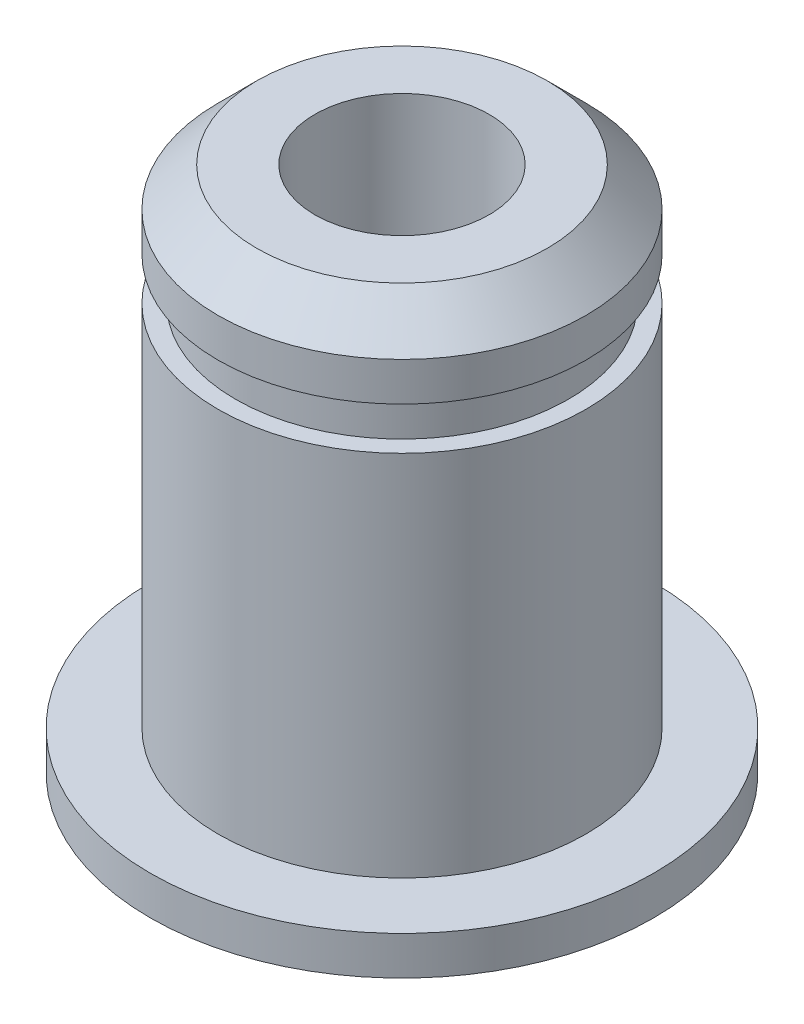
ISO-10303-21;
HEADER;
FILE_DESCRIPTION(('STEP AP214'),'2;1');
FILE_NAME('part.step','',(''),(''),'','','');
FILE_SCHEMA(('AUTOMOTIVE_DESIGN { 1 0 10303 214 1 1 1 1 }'));
ENDSEC;
DATA;
#1=APPLICATION_CONTEXT('core data for automotive mechanical design processes');
#2=APPLICATION_PROTOCOL_DEFINITION('international standard','automotive_design',2000,#1);
#3=PRODUCT_CONTEXT('',#1,'mechanical');
#4=PRODUCT('Part','Part','',(#3));
#5=PRODUCT_RELATED_PRODUCT_CATEGORY('part','',(#4));
#6=PRODUCT_DEFINITION_FORMATION('','',#4);
#7=PRODUCT_DEFINITION_CONTEXT('part definition',#1,'design');
#8=PRODUCT_DEFINITION('design','',#6,#7);
#9=PRODUCT_DEFINITION_SHAPE('','',#8);
#10=(LENGTH_UNIT() NAMED_UNIT(*) SI_UNIT(.MILLI.,.METRE.));
#11=(NAMED_UNIT(*) PLANE_ANGLE_UNIT() SI_UNIT($,.RADIAN.));
#12=(NAMED_UNIT(*) SI_UNIT($,.STERADIAN.) SOLID_ANGLE_UNIT());
#13=UNCERTAINTY_MEASURE_WITH_UNIT(LENGTH_MEASURE(1.E-05),#10,'distance_accuracy_value','');
#14=(GEOMETRIC_REPRESENTATION_CONTEXT(3) GLOBAL_UNCERTAINTY_ASSIGNED_CONTEXT((#13)) GLOBAL_UNIT_ASSIGNED_CONTEXT((#10,
#11,#12)) REPRESENTATION_CONTEXT('',''));
#15=CARTESIAN_POINT('',(0.,0.,0.));
#16=DIRECTION('',(0.,0.,1.));
#17=DIRECTION('',(1.,0.,0.));
#18=AXIS2_PLACEMENT_3D('',#15,#16,#17);
#19=CARTESIAN_POINT('',(0.,13.6,0.));
#20=DIRECTION('',(0.,1.,0.));
#21=DIRECTION('',(0.,0.,1.));
#22=AXIS2_PLACEMENT_3D('',#19,#20,#21);
#23=CYLINDRICAL_SURFACE('',#22,2.25);
#24=CARTESIAN_POINT('',(0.,13.6,0.));
#25=DIRECTION('',(0.,1.,0.));
#26=DIRECTION('',(0.,0.,1.));
#27=AXIS2_PLACEMENT_3D('',#24,#25,#26);
#28=CIRCLE('',#27,2.25);
#29=CARTESIAN_POINT('',(0.,13.6,2.25));
#30=VERTEX_POINT('',#29);
#31=EDGE_CURVE('E73',#30,#30,#28,.T.);
#32=ORIENTED_EDGE('',*,*,#31,.T.);
#33=EDGE_LOOP('',(#32));
#34=FACE_BOUND('',#33,.T.);
#35=CARTESIAN_POINT('',(0.,0.,0.));
#36=DIRECTION('',(0.,1.,0.));
#37=DIRECTION('',(0.,0.,1.));
#38=AXIS2_PLACEMENT_3D('',#35,#36,#37);
#39=CIRCLE('',#38,2.25);
#40=CARTESIAN_POINT('',(0.,0.,2.25));
#41=VERTEX_POINT('',#40);
#42=EDGE_CURVE('E46',#41,#41,#39,.T.);
#43=ORIENTED_EDGE('',*,*,#42,.F.);
#44=EDGE_LOOP('',(#43));
#45=FACE_BOUND('',#44,.T.);
#46=ADVANCED_FACE('F35',(#34,#45),#23,.F.);
#47=CARTESIAN_POINT('',(0.,0.,0.));
#48=DIRECTION('',(0.,1.,0.));
#49=DIRECTION('',(0.,0.,1.));
#50=AXIS2_PLACEMENT_3D('',#47,#48,#49);
#51=PLANE('',#50);
#52=CARTESIAN_POINT('',(0.,0.,0.));
#53=DIRECTION('',(0.,1.,0.));
#54=DIRECTION('',(0.,0.,1.));
#55=AXIS2_PLACEMENT_3D('',#52,#53,#54);
#56=CIRCLE('',#55,6.5);
#57=CARTESIAN_POINT('',(0.,0.,6.5));
#58=VERTEX_POINT('',#57);
#59=EDGE_CURVE('E50',#58,#58,#56,.T.);
#60=ORIENTED_EDGE('',*,*,#59,.F.);
#61=EDGE_LOOP('',(#60));
#62=FACE_BOUND('',#61,.T.);
#63=ORIENTED_EDGE('',*,*,#42,.T.);
#64=EDGE_LOOP('',(#63));
#65=FACE_BOUND('',#64,.T.);
#66=ADVANCED_FACE('F91',(#62,#65),#51,.F.);
#67=CARTESIAN_POINT('',(0.,13.6,0.));
#68=DIRECTION('',(0.,1.,0.));
#69=DIRECTION('',(0.,0.,1.));
#70=AXIS2_PLACEMENT_3D('',#67,#68,#69);
#71=CYLINDRICAL_SURFACE('',#70,6.5);
#72=CARTESIAN_POINT('',(0.,0.999999999999999,0.));
#73=DIRECTION('',(0.,1.,0.));
#74=DIRECTION('',(0.,0.,1.));
#75=AXIS2_PLACEMENT_3D('',#72,#73,#74);
#76=CIRCLE('',#75,6.5);
#77=CARTESIAN_POINT('',(0.,0.999999999999999,6.5));
#78=VERTEX_POINT('',#77);
#79=EDGE_CURVE('E55',#78,#78,#76,.T.);
#80=ORIENTED_EDGE('',*,*,#79,.F.);
#81=EDGE_LOOP('',(#80));
#82=FACE_BOUND('',#81,.T.);
#83=ORIENTED_EDGE('',*,*,#59,.T.);
#84=EDGE_LOOP('',(#83));
#85=FACE_BOUND('',#84,.T.);
#86=ADVANCED_FACE('F95',(#82,#85),#71,.T.);
#87=CARTESIAN_POINT('',(0.,1.,0.));
#88=DIRECTION('',(0.,-1.,0.));
#89=DIRECTION('',(0.,0.,-1.));
#90=AXIS2_PLACEMENT_3D('',#87,#88,#89);
#91=PLANE('',#90);
#92=CARTESIAN_POINT('',(0.,0.999999999999999,0.));
#93=DIRECTION('',(0.,1.,0.));
#94=DIRECTION('',(0.,0.,1.));
#95=AXIS2_PLACEMENT_3D('',#92,#93,#94);
#96=CIRCLE('',#95,4.75);
#97=CARTESIAN_POINT('',(0.,0.999999999999999,4.75));
#98=VERTEX_POINT('',#97);
#99=EDGE_CURVE('E58',#98,#98,#96,.T.);
#100=ORIENTED_EDGE('',*,*,#99,.F.);
#101=EDGE_LOOP('',(#100));
#102=FACE_BOUND('',#101,.T.);
#103=ORIENTED_EDGE('',*,*,#79,.T.);
#104=EDGE_LOOP('',(#103));
#105=FACE_BOUND('',#104,.T.);
#106=ADVANCED_FACE('F101',(#102,#105),#91,.F.);
#107=CARTESIAN_POINT('',(0.,13.6,0.));
#108=DIRECTION('',(0.,1.,0.));
#109=DIRECTION('',(0.,0.,1.));
#110=AXIS2_PLACEMENT_3D('',#107,#108,#109);
#111=CYLINDRICAL_SURFACE('',#110,4.75);
#112=CARTESIAN_POINT('',(0.,10.5,0.));
#113=DIRECTION('',(0.,1.,0.));
#114=DIRECTION('',(0.,0.,1.));
#115=AXIS2_PLACEMENT_3D('',#112,#113,#114);
#116=CIRCLE('',#115,4.75);
#117=CARTESIAN_POINT('',(0.,10.5,4.75));
#118=VERTEX_POINT('',#117);
#119=EDGE_CURVE('E61',#118,#118,#116,.T.);
#120=ORIENTED_EDGE('',*,*,#119,.F.);
#121=EDGE_LOOP('',(#120));
#122=FACE_BOUND('',#121,.T.);
#123=ORIENTED_EDGE('',*,*,#99,.T.);
#124=EDGE_LOOP('',(#123));
#125=FACE_BOUND('',#124,.T.);
#126=ADVANCED_FACE('F105',(#122,#125),#111,.T.);
#127=CARTESIAN_POINT('',(0.,10.5,0.));
#128=DIRECTION('',(0.,-1.,0.));
#129=DIRECTION('',(0.,0.,-1.));
#130=AXIS2_PLACEMENT_3D('',#127,#128,#129);
#131=PLANE('',#130);
#132=CARTESIAN_POINT('',(0.,10.5,0.));
#133=DIRECTION('',(0.,1.,0.));
#134=DIRECTION('',(0.,0.,1.));
#135=AXIS2_PLACEMENT_3D('',#132,#133,#134);
#136=CIRCLE('',#135,4.3);
#137=CARTESIAN_POINT('',(0.,10.5,4.3));
#138=VERTEX_POINT('',#137);
#139=EDGE_CURVE('E64',#138,#138,#136,.T.);
#140=ORIENTED_EDGE('',*,*,#139,.F.);
#141=EDGE_LOOP('',(#140));
#142=FACE_BOUND('',#141,.T.);
#143=ORIENTED_EDGE('',*,*,#119,.T.);
#144=EDGE_LOOP('',(#143));
#145=FACE_BOUND('',#144,.T.);
#146=ADVANCED_FACE('F109',(#142,#145),#131,.F.);
#147=CARTESIAN_POINT('',(0.,13.6,0.));
#148=DIRECTION('',(0.,1.,0.));
#149=DIRECTION('',(0.,0.,1.));
#150=AXIS2_PLACEMENT_3D('',#147,#148,#149);
#151=CYLINDRICAL_SURFACE('',#150,4.3);
#152=CARTESIAN_POINT('',(0.,11.6,0.));
#153=DIRECTION('',(0.,1.,0.));
#154=DIRECTION('',(0.,0.,1.));
#155=AXIS2_PLACEMENT_3D('',#152,#153,#154);
#156=CIRCLE('',#155,4.3);
#157=CARTESIAN_POINT('',(0.,11.6,4.3));
#158=VERTEX_POINT('',#157);
#159=EDGE_CURVE('E67',#158,#158,#156,.T.);
#160=ORIENTED_EDGE('',*,*,#159,.F.);
#161=EDGE_LOOP('',(#160));
#162=FACE_BOUND('',#161,.T.);
#163=ORIENTED_EDGE('',*,*,#139,.T.);
#164=EDGE_LOOP('',(#163));
#165=FACE_BOUND('',#164,.T.);
#166=ADVANCED_FACE('F113',(#162,#165),#151,.T.);
#167=CARTESIAN_POINT('',(0.,11.6,0.));
#168=DIRECTION('',(0.,1.,0.));
#169=DIRECTION('',(0.,0.,1.));
#170=AXIS2_PLACEMENT_3D('',#167,#168,#169);
#171=PLANE('',#170);
#172=CARTESIAN_POINT('',(0.,11.6,0.));
#173=DIRECTION('',(0.,1.,0.));
#174=DIRECTION('',(0.,0.,1.));
#175=AXIS2_PLACEMENT_3D('',#172,#173,#174);
#176=CIRCLE('',#175,4.75);
#177=CARTESIAN_POINT('',(0.,11.6,4.75));
#178=VERTEX_POINT('',#177);
#179=EDGE_CURVE('E70',#178,#178,#176,.T.);
#180=ORIENTED_EDGE('',*,*,#179,.F.);
#181=EDGE_LOOP('',(#180));
#182=FACE_BOUND('',#181,.T.);
#183=ORIENTED_EDGE('',*,*,#159,.T.);
#184=EDGE_LOOP('',(#183));
#185=FACE_BOUND('',#184,.T.);
#186=ADVANCED_FACE('F88',(#182,#185),#171,.F.);
#187=CARTESIAN_POINT('',(0.,13.6,0.));
#188=DIRECTION('',(0.,1.,0.));
#189=DIRECTION('',(0.,0.,1.));
#190=AXIS2_PLACEMENT_3D('',#187,#188,#189);
#191=CYLINDRICAL_SURFACE('',#190,4.75);
#192=CARTESIAN_POINT('',(0.,12.6,0.));
#193=DIRECTION('',(0.,-1.,0.));
#194=DIRECTION('',(0.,0.,-1.));
#195=AXIS2_PLACEMENT_3D('',#192,#193,#194);
#196=CIRCLE('',#195,4.75);
#197=CARTESIAN_POINT('',(0.,12.6,-4.75));
#198=VERTEX_POINT('',#197);
#199=EDGE_CURVE('E10',#198,#198,#196,.T.);
#200=ORIENTED_EDGE('',*,*,#199,.T.);
#201=EDGE_LOOP('',(#200));
#202=FACE_BOUND('',#201,.T.);
#203=ORIENTED_EDGE('',*,*,#179,.T.);
#204=EDGE_LOOP('',(#203));
#205=FACE_BOUND('',#204,.T.);
#206=ADVANCED_FACE('F81',(#202,#205),#191,.T.);
#207=CARTESIAN_POINT('',(0.,13.6,0.));
#208=DIRECTION('',(0.,-1.,0.));
#209=DIRECTION('',(0.,0.,-1.));
#210=AXIS2_PLACEMENT_3D('',#207,#208,#209);
#211=PLANE('',#210);
#212=CARTESIAN_POINT('',(0.,13.6,0.));
#213=DIRECTION('',(0.,-1.,0.));
#214=DIRECTION('',(0.,0.,-1.));
#215=AXIS2_PLACEMENT_3D('',#212,#213,#214);
#216=CIRCLE('',#215,3.75);
#217=CARTESIAN_POINT('',(0.,13.6,-3.75));
#218=VERTEX_POINT('',#217);
#219=EDGE_CURVE('E42',#218,#218,#216,.F.);
#220=ORIENTED_EDGE('',*,*,#219,.T.);
#221=EDGE_LOOP('',(#220));
#222=FACE_BOUND('',#221,.T.);
#223=ORIENTED_EDGE('',*,*,#31,.F.);
#224=EDGE_LOOP('',(#223));
#225=FACE_BOUND('',#224,.T.);
#226=ADVANCED_FACE('F79',(#222,#225),#211,.F.);
#227=CARTESIAN_POINT('',(0.,13.6,0.));
#228=DIRECTION('',(0.,-1.,0.));
#229=DIRECTION('',(0.,0.,-1.));
#230=AXIS2_PLACEMENT_3D('',#227,#228,#229);
#231=CONICAL_SURFACE('',#230,3.75,0.785398163397447);
#232=ORIENTED_EDGE('',*,*,#199,.F.);
#233=EDGE_LOOP('',(#232));
#234=FACE_BOUND('',#233,.T.);
#235=ORIENTED_EDGE('',*,*,#219,.F.);
#236=EDGE_LOOP('',(#235));
#237=FACE_BOUND('',#236,.T.);
#238=ADVANCED_FACE('F37',(#234,#237),#231,.T.);
#239=CLOSED_SHELL('',(#46,#66,#86,#106,#126,#146,#166,#186,#206,#226,#238));
#240=MANIFOLD_SOLID_BREP('B2',#239);
#241=ADVANCED_BREP_SHAPE_REPRESENTATION('',(#18,#240),#14);
#242=SHAPE_DEFINITION_REPRESENTATION(#9,#241);
ENDSEC;
END-ISO-10303-21;
